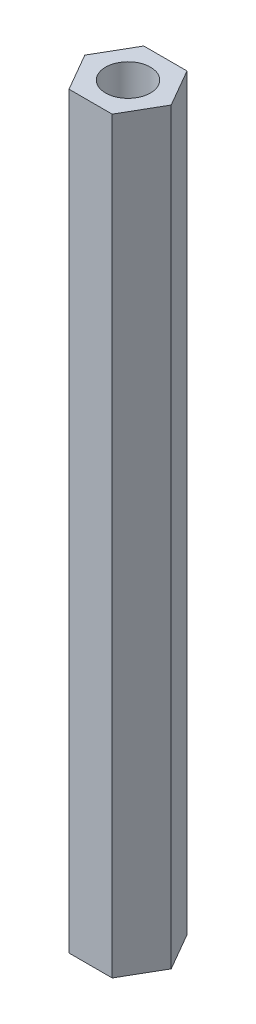
ISO-10303-21;
HEADER;
FILE_DESCRIPTION(('STEP AP214'),'2;1');
FILE_NAME('part.step','',(''),(''),'','','');
FILE_SCHEMA(('AUTOMOTIVE_DESIGN { 1 0 10303 214 1 1 1 1 }'));
ENDSEC;
DATA;
#1=APPLICATION_CONTEXT('core data for automotive mechanical design processes');
#2=APPLICATION_PROTOCOL_DEFINITION('international standard','automotive_design',2000,#1);
#3=PRODUCT_CONTEXT('',#1,'mechanical');
#4=PRODUCT('Part','Part','',(#3));
#5=PRODUCT_RELATED_PRODUCT_CATEGORY('part','',(#4));
#6=PRODUCT_DEFINITION_FORMATION('','',#4);
#7=PRODUCT_DEFINITION_CONTEXT('part definition',#1,'design');
#8=PRODUCT_DEFINITION('design','',#6,#7);
#9=PRODUCT_DEFINITION_SHAPE('','',#8);
#10=(LENGTH_UNIT() NAMED_UNIT(*) SI_UNIT(.MILLI.,.METRE.));
#11=(NAMED_UNIT(*) PLANE_ANGLE_UNIT() SI_UNIT($,.RADIAN.));
#12=(NAMED_UNIT(*) SI_UNIT($,.STERADIAN.) SOLID_ANGLE_UNIT());
#13=UNCERTAINTY_MEASURE_WITH_UNIT(LENGTH_MEASURE(1.E-05),#10,'distance_accuracy_value','');
#14=(GEOMETRIC_REPRESENTATION_CONTEXT(3) GLOBAL_UNCERTAINTY_ASSIGNED_CONTEXT((#13)) GLOBAL_UNIT_ASSIGNED_CONTEXT((#10,
#11,#12)) REPRESENTATION_CONTEXT('',''));
#15=CARTESIAN_POINT('',(0.,0.,0.));
#16=DIRECTION('',(0.,0.,1.));
#17=DIRECTION('',(1.,0.,0.));
#18=AXIS2_PLACEMENT_3D('',#15,#16,#17);
#19=CARTESIAN_POINT('',(0.,70.,0.));
#20=DIRECTION('',(0.,1.,0.));
#21=DIRECTION('',(0.,0.,1.));
#22=AXIS2_PLACEMENT_3D('',#19,#20,#21);
#23=PLANE('',#22);
#24=DIRECTION('',(0.5,0.,-0.866025403784439));
#25=VECTOR('',#24,1.);
#26=CARTESIAN_POINT('',(2.02072594216369,70.,3.5));
#27=LINE('',#26,#25);
#28=CARTESIAN_POINT('',(2.02072594216369,70.,3.5));
#29=VERTEX_POINT('',#28);
#30=CARTESIAN_POINT('',(4.04145188432738,70.,0.));
#31=VERTEX_POINT('',#30);
#32=EDGE_CURVE('E152',#29,#31,#27,.T.);
#33=ORIENTED_EDGE('',*,*,#32,.T.);
#34=DIRECTION('',(-0.5,0.,-0.866025403784439));
#35=VECTOR('',#34,1.);
#36=CARTESIAN_POINT('',(4.04145188432738,70.,0.));
#37=LINE('',#36,#35);
#38=CARTESIAN_POINT('',(2.02072594216369,70.,-3.5));
#39=VERTEX_POINT('',#38);
#40=EDGE_CURVE('E100',#31,#39,#37,.T.);
#41=ORIENTED_EDGE('',*,*,#40,.T.);
#42=DIRECTION('',(-1.,0.,0.));
#43=VECTOR('',#42,1.);
#44=CARTESIAN_POINT('',(2.02072594216369,70.,-3.5));
#45=LINE('',#44,#43);
#46=CARTESIAN_POINT('',(-2.02072594216369,70.,-3.5));
#47=VERTEX_POINT('',#46);
#48=EDGE_CURVE('E113',#39,#47,#45,.T.);
#49=ORIENTED_EDGE('',*,*,#48,.T.);
#50=DIRECTION('',(-0.5,0.,0.866025403784439));
#51=VECTOR('',#50,1.);
#52=CARTESIAN_POINT('',(-2.02072594216369,70.,-3.5));
#53=LINE('',#52,#51);
#54=CARTESIAN_POINT('',(-4.04145188432738,70.,0.));
#55=VERTEX_POINT('',#54);
#56=EDGE_CURVE('E107',#47,#55,#53,.T.);
#57=ORIENTED_EDGE('',*,*,#56,.T.);
#58=DIRECTION('',(0.5,0.,0.866025403784439));
#59=VECTOR('',#58,1.);
#60=CARTESIAN_POINT('',(-4.04145188432738,70.,0.));
#61=LINE('',#60,#59);
#62=CARTESIAN_POINT('',(-2.02072594216369,70.,3.5));
#63=VERTEX_POINT('',#62);
#64=EDGE_CURVE('E111',#55,#63,#61,.T.);
#65=ORIENTED_EDGE('',*,*,#64,.T.);
#66=DIRECTION('',(1.,0.,0.));
#67=VECTOR('',#66,1.);
#68=CARTESIAN_POINT('',(-2.02072594216369,70.,3.5));
#69=LINE('',#68,#67);
#70=EDGE_CURVE('E63',#63,#29,#69,.T.);
#71=ORIENTED_EDGE('',*,*,#70,.T.);
#72=EDGE_LOOP('',(#33,#41,#49,#57,#65,#71));
#73=FACE_BOUND('',#72,.T.);
#74=CARTESIAN_POINT('',(0.,70.,0.));
#75=DIRECTION('',(0.,1.,0.));
#76=DIRECTION('',(0.,0.,1.));
#77=AXIS2_PLACEMENT_3D('',#74,#75,#76);
#78=CIRCLE('',#77,2.1);
#79=CARTESIAN_POINT('',(0.,70.,2.1));
#80=VERTEX_POINT('',#79);
#81=EDGE_CURVE('E140',#80,#80,#78,.T.);
#82=ORIENTED_EDGE('',*,*,#81,.F.);
#83=EDGE_LOOP('',(#82));
#84=FACE_BOUND('',#83,.T.);
#85=ADVANCED_FACE('F45',(#73,#84),#23,.T.);
#86=CARTESIAN_POINT('',(0.,0.,0.));
#87=DIRECTION('',(0.,1.,0.));
#88=DIRECTION('',(0.,0.,1.));
#89=AXIS2_PLACEMENT_3D('',#86,#87,#88);
#90=PLANE('',#89);
#91=DIRECTION('',(0.5,0.,-0.866025403784439));
#92=VECTOR('',#91,1.);
#93=CARTESIAN_POINT('',(2.02072594216369,0.,3.5));
#94=LINE('',#93,#92);
#95=CARTESIAN_POINT('',(2.02072594216369,0.,3.5));
#96=VERTEX_POINT('',#95);
#97=CARTESIAN_POINT('',(4.04145188432738,0.,0.));
#98=VERTEX_POINT('',#97);
#99=EDGE_CURVE('E135',#96,#98,#94,.T.);
#100=ORIENTED_EDGE('',*,*,#99,.F.);
#101=DIRECTION('',(1.,0.,0.));
#102=VECTOR('',#101,1.);
#103=CARTESIAN_POINT('',(-2.02072594216369,0.,3.5));
#104=LINE('',#103,#102);
#105=CARTESIAN_POINT('',(-2.02072594216369,0.,3.5));
#106=VERTEX_POINT('',#105);
#107=EDGE_CURVE('E92',#106,#96,#104,.T.);
#108=ORIENTED_EDGE('',*,*,#107,.F.);
#109=DIRECTION('',(0.5,0.,0.866025403784439));
#110=VECTOR('',#109,1.);
#111=CARTESIAN_POINT('',(-4.04145188432738,0.,0.));
#112=LINE('',#111,#110);
#113=CARTESIAN_POINT('',(-4.04145188432738,0.,0.));
#114=VERTEX_POINT('',#113);
#115=EDGE_CURVE('E86',#114,#106,#112,.T.);
#116=ORIENTED_EDGE('',*,*,#115,.F.);
#117=DIRECTION('',(-0.5,0.,0.866025403784439));
#118=VECTOR('',#117,1.);
#119=CARTESIAN_POINT('',(-2.02072594216369,0.,-3.5));
#120=LINE('',#119,#118);
#121=CARTESIAN_POINT('',(-2.02072594216369,0.,-3.5));
#122=VERTEX_POINT('',#121);
#123=EDGE_CURVE('E122',#122,#114,#120,.T.);
#124=ORIENTED_EDGE('',*,*,#123,.F.);
#125=DIRECTION('',(-1.,0.,0.));
#126=VECTOR('',#125,1.);
#127=CARTESIAN_POINT('',(2.02072594216369,0.,-3.5));
#128=LINE('',#127,#126);
#129=CARTESIAN_POINT('',(2.02072594216369,0.,-3.5));
#130=VERTEX_POINT('',#129);
#131=EDGE_CURVE('E143',#130,#122,#128,.T.);
#132=ORIENTED_EDGE('',*,*,#131,.F.);
#133=DIRECTION('',(-0.5,0.,-0.866025403784439));
#134=VECTOR('',#133,1.);
#135=CARTESIAN_POINT('',(4.04145188432738,0.,0.));
#136=LINE('',#135,#134);
#137=EDGE_CURVE('E139',#98,#130,#136,.T.);
#138=ORIENTED_EDGE('',*,*,#137,.F.);
#139=EDGE_LOOP('',(#100,#108,#116,#124,#132,#138));
#140=FACE_BOUND('',#139,.T.);
#141=CARTESIAN_POINT('',(0.,0.,0.));
#142=DIRECTION('',(0.,1.,0.));
#143=DIRECTION('',(0.,0.,1.));
#144=AXIS2_PLACEMENT_3D('',#141,#142,#143);
#145=CIRCLE('',#144,2.1);
#146=CARTESIAN_POINT('',(0.,0.,2.1));
#147=VERTEX_POINT('',#146);
#148=EDGE_CURVE('E249',#147,#147,#145,.T.);
#149=ORIENTED_EDGE('',*,*,#148,.T.);
#150=EDGE_LOOP('',(#149));
#151=FACE_BOUND('',#150,.T.);
#152=ADVANCED_FACE('F165',(#140,#151),#90,.F.);
#153=CARTESIAN_POINT('',(2.02072594216369,70.,3.5));
#154=DIRECTION('',(-0.866025403784439,0.,-0.5));
#155=DIRECTION('',(-0.5,0.,0.866025403784439));
#156=AXIS2_PLACEMENT_3D('',#153,#154,#155);
#157=PLANE('',#156);
#158=ORIENTED_EDGE('',*,*,#99,.T.);
#159=DIRECTION('',(0.,-1.,0.));
#160=VECTOR('',#159,1.);
#161=CARTESIAN_POINT('',(4.04145188432738,70.,0.));
#162=LINE('',#161,#160);
#163=EDGE_CURVE('E11',#31,#98,#162,.T.);
#164=ORIENTED_EDGE('',*,*,#163,.F.);
#165=ORIENTED_EDGE('',*,*,#32,.F.);
#166=DIRECTION('',(0.,-1.,0.));
#167=VECTOR('',#166,1.);
#168=CARTESIAN_POINT('',(2.02072594216369,70.,3.5));
#169=LINE('',#168,#167);
#170=EDGE_CURVE('E131',#29,#96,#169,.T.);
#171=ORIENTED_EDGE('',*,*,#170,.T.);
#172=EDGE_LOOP('',(#158,#164,#165,#171));
#173=FACE_BOUND('',#172,.T.);
#174=ADVANCED_FACE('F47',(#173),#157,.F.);
#175=CARTESIAN_POINT('',(4.04145188432738,70.,0.));
#176=DIRECTION('',(-0.866025403784439,0.,0.5));
#177=DIRECTION('',(0.5,0.,0.866025403784439));
#178=AXIS2_PLACEMENT_3D('',#175,#176,#177);
#179=PLANE('',#178);
#180=ORIENTED_EDGE('',*,*,#137,.T.);
#181=DIRECTION('',(0.,-1.,0.));
#182=VECTOR('',#181,1.);
#183=CARTESIAN_POINT('',(2.02072594216369,70.,-3.5));
#184=LINE('',#183,#182);
#185=EDGE_CURVE('E55',#39,#130,#184,.T.);
#186=ORIENTED_EDGE('',*,*,#185,.F.);
#187=ORIENTED_EDGE('',*,*,#40,.F.);
#188=ORIENTED_EDGE('',*,*,#163,.T.);
#189=EDGE_LOOP('',(#180,#186,#187,#188));
#190=FACE_BOUND('',#189,.T.);
#191=ADVANCED_FACE('F190',(#190),#179,.F.);
#192=CARTESIAN_POINT('',(2.02072594216369,70.,-3.5));
#193=DIRECTION('',(0.,0.,1.));
#194=DIRECTION('',(1.,0.,0.));
#195=AXIS2_PLACEMENT_3D('',#192,#193,#194);
#196=PLANE('',#195);
#197=ORIENTED_EDGE('',*,*,#131,.T.);
#198=DIRECTION('',(0.,-1.,0.));
#199=VECTOR('',#198,1.);
#200=CARTESIAN_POINT('',(-2.02072594216369,70.,-3.5));
#201=LINE('',#200,#199);
#202=EDGE_CURVE('E124',#47,#122,#201,.T.);
#203=ORIENTED_EDGE('',*,*,#202,.F.);
#204=ORIENTED_EDGE('',*,*,#48,.F.);
#205=ORIENTED_EDGE('',*,*,#185,.T.);
#206=EDGE_LOOP('',(#197,#203,#204,#205));
#207=FACE_BOUND('',#206,.T.);
#208=ADVANCED_FACE('F162',(#207),#196,.F.);
#209=CARTESIAN_POINT('',(-2.02072594216369,70.,-3.5));
#210=DIRECTION('',(0.866025403784439,0.,0.5));
#211=DIRECTION('',(0.5,0.,-0.866025403784439));
#212=AXIS2_PLACEMENT_3D('',#209,#210,#211);
#213=PLANE('',#212);
#214=ORIENTED_EDGE('',*,*,#123,.T.);
#215=DIRECTION('',(0.,-1.,0.));
#216=VECTOR('',#215,1.);
#217=CARTESIAN_POINT('',(-4.04145188432738,70.,0.));
#218=LINE('',#217,#216);
#219=EDGE_CURVE('E119',#55,#114,#218,.T.);
#220=ORIENTED_EDGE('',*,*,#219,.F.);
#221=ORIENTED_EDGE('',*,*,#56,.F.);
#222=ORIENTED_EDGE('',*,*,#202,.T.);
#223=EDGE_LOOP('',(#214,#220,#221,#222));
#224=FACE_BOUND('',#223,.T.);
#225=ADVANCED_FACE('F120',(#224),#213,.F.);
#226=CARTESIAN_POINT('',(-4.04145188432738,70.,0.));
#227=DIRECTION('',(0.866025403784439,0.,-0.5));
#228=DIRECTION('',(-0.5,0.,-0.866025403784439));
#229=AXIS2_PLACEMENT_3D('',#226,#227,#228);
#230=PLANE('',#229);
#231=ORIENTED_EDGE('',*,*,#115,.T.);
#232=DIRECTION('',(0.,-1.,0.));
#233=VECTOR('',#232,1.);
#234=CARTESIAN_POINT('',(-2.02072594216369,70.,3.5));
#235=LINE('',#234,#233);
#236=EDGE_CURVE('E125',#63,#106,#235,.T.);
#237=ORIENTED_EDGE('',*,*,#236,.F.);
#238=ORIENTED_EDGE('',*,*,#64,.F.);
#239=ORIENTED_EDGE('',*,*,#219,.T.);
#240=EDGE_LOOP('',(#231,#237,#238,#239));
#241=FACE_BOUND('',#240,.T.);
#242=ADVANCED_FACE('F127',(#241),#230,.F.);
#243=CARTESIAN_POINT('',(-2.02072594216369,70.,3.5));
#244=DIRECTION('',(0.,0.,-1.));
#245=DIRECTION('',(-1.,0.,0.));
#246=AXIS2_PLACEMENT_3D('',#243,#244,#245);
#247=PLANE('',#246);
#248=ORIENTED_EDGE('',*,*,#107,.T.);
#249=ORIENTED_EDGE('',*,*,#170,.F.);
#250=ORIENTED_EDGE('',*,*,#70,.F.);
#251=ORIENTED_EDGE('',*,*,#236,.T.);
#252=EDGE_LOOP('',(#248,#249,#250,#251));
#253=FACE_BOUND('',#252,.T.);
#254=ADVANCED_FACE('F170',(#253),#247,.F.);
#255=CARTESIAN_POINT('',(0.,70.,0.));
#256=DIRECTION('',(0.,-1.,0.));
#257=DIRECTION('',(0.,0.,-1.));
#258=AXIS2_PLACEMENT_3D('',#255,#256,#257);
#259=CYLINDRICAL_SURFACE('',#258,2.1);
#260=ORIENTED_EDGE('',*,*,#81,.T.);
#261=EDGE_LOOP('',(#260));
#262=FACE_BOUND('',#261,.T.);
#263=ORIENTED_EDGE('',*,*,#148,.F.);
#264=EDGE_LOOP('',(#263));
#265=FACE_BOUND('',#264,.T.);
#266=ADVANCED_FACE('F172',(#262,#265),#259,.F.);
#267=CLOSED_SHELL('',(#85,#152,#174,#191,#208,#225,#242,#254,#266));
#268=MANIFOLD_SOLID_BREP('B2',#267);
#269=ADVANCED_BREP_SHAPE_REPRESENTATION('',(#18,#268),#14);
#270=SHAPE_DEFINITION_REPRESENTATION(#9,#269);
ENDSEC;
END-ISO-10303-21;
